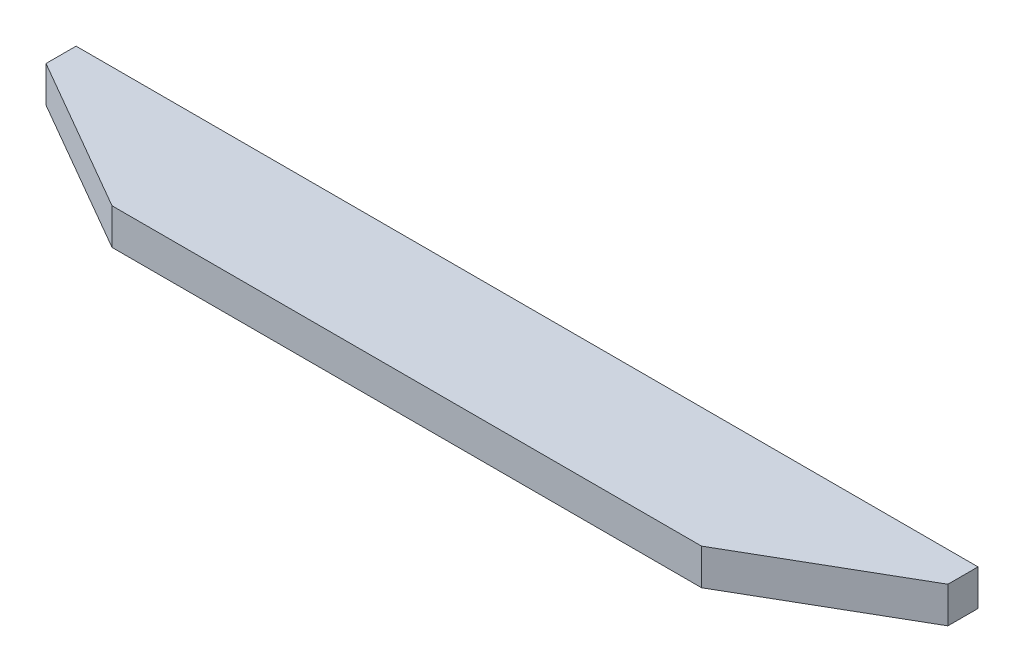
ISO-10303-21;
HEADER;
FILE_DESCRIPTION(('STEP AP214'),'2;1');
FILE_NAME('part.step','',(''),(''),'','','');
FILE_SCHEMA(('AUTOMOTIVE_DESIGN { 1 0 10303 214 1 1 1 1 }'));
ENDSEC;
DATA;
#1=APPLICATION_CONTEXT('core data for automotive mechanical design processes');
#2=APPLICATION_PROTOCOL_DEFINITION('international standard','automotive_design',2000,#1);
#3=PRODUCT_CONTEXT('',#1,'mechanical');
#4=PRODUCT('Part','Part','',(#3));
#5=PRODUCT_RELATED_PRODUCT_CATEGORY('part','',(#4));
#6=PRODUCT_DEFINITION_FORMATION('','',#4);
#7=PRODUCT_DEFINITION_CONTEXT('part definition',#1,'design');
#8=PRODUCT_DEFINITION('design','',#6,#7);
#9=PRODUCT_DEFINITION_SHAPE('','',#8);
#10=(LENGTH_UNIT() NAMED_UNIT(*) SI_UNIT(.MILLI.,.METRE.));
#11=(NAMED_UNIT(*) PLANE_ANGLE_UNIT() SI_UNIT($,.RADIAN.));
#12=(NAMED_UNIT(*) SI_UNIT($,.STERADIAN.) SOLID_ANGLE_UNIT());
#13=UNCERTAINTY_MEASURE_WITH_UNIT(LENGTH_MEASURE(1.E-05),#10,'distance_accuracy_value','');
#14=(GEOMETRIC_REPRESENTATION_CONTEXT(3) GLOBAL_UNCERTAINTY_ASSIGNED_CONTEXT((#13)) GLOBAL_UNIT_ASSIGNED_CONTEXT((#10,
#11,#12)) REPRESENTATION_CONTEXT('',''));
#15=CARTESIAN_POINT('',(0.,0.,0.));
#16=DIRECTION('',(0.,0.,1.));
#17=DIRECTION('',(1.,0.,0.));
#18=AXIS2_PLACEMENT_3D('',#15,#16,#17);
#19=CARTESIAN_POINT('',(-75.,6.,20.));
#20=DIRECTION('',(1.,0.,0.));
#21=DIRECTION('',(0.,0.,-1.));
#22=AXIS2_PLACEMENT_3D('',#19,#20,#21);
#23=PLANE('',#22);
#24=DIRECTION('',(0.,0.,-1.));
#25=VECTOR('',#24,1.);
#26=CARTESIAN_POINT('',(-75.,0.,20.));
#27=LINE('',#26,#25);
#28=CARTESIAN_POINT('',(-75.,0.,4.99999999999998));
#29=VERTEX_POINT('',#28);
#30=CARTESIAN_POINT('',(-75.,0.,0.));
#31=VERTEX_POINT('',#30);
#32=EDGE_CURVE('E100',#29,#31,#27,.T.);
#33=ORIENTED_EDGE('',*,*,#32,.F.);
#34=DIRECTION('',(0.,1.,0.));
#35=VECTOR('',#34,1.);
#36=CARTESIAN_POINT('',(-75.,6.,4.99999999999998));
#37=LINE('',#36,#35);
#38=CARTESIAN_POINT('',(-75.,6.,4.99999999999998));
#39=VERTEX_POINT('',#38);
#40=EDGE_CURVE('E11',#29,#39,#37,.T.);
#41=ORIENTED_EDGE('',*,*,#40,.T.);
#42=DIRECTION('',(0.,0.,-1.));
#43=VECTOR('',#42,1.);
#44=CARTESIAN_POINT('',(-75.,6.,20.));
#45=LINE('',#44,#43);
#46=CARTESIAN_POINT('',(-75.,6.,0.));
#47=VERTEX_POINT('',#46);
#48=EDGE_CURVE('E122',#39,#47,#45,.T.);
#49=ORIENTED_EDGE('',*,*,#48,.T.);
#50=DIRECTION('',(0.,-1.,0.));
#51=VECTOR('',#50,1.);
#52=CARTESIAN_POINT('',(-75.,6.,0.));
#53=LINE('',#52,#51);
#54=EDGE_CURVE('E116',#47,#31,#53,.T.);
#55=ORIENTED_EDGE('',*,*,#54,.T.);
#56=EDGE_LOOP('',(#33,#41,#49,#55));
#57=FACE_BOUND('',#56,.T.);
#58=ADVANCED_FACE('F47',(#57),#23,.F.);
#59=CARTESIAN_POINT('',(-75.,0.,20.));
#60=DIRECTION('',(0.,1.,0.));
#61=DIRECTION('',(0.,0.,1.));
#62=AXIS2_PLACEMENT_3D('',#59,#60,#61);
#63=PLANE('',#62);
#64=DIRECTION('',(0.,0.,-1.));
#65=VECTOR('',#64,1.);
#66=CARTESIAN_POINT('',(75.,0.,20.));
#67=LINE('',#66,#65);
#68=CARTESIAN_POINT('',(75.,0.,4.99999999999998));
#69=VERTEX_POINT('',#68);
#70=CARTESIAN_POINT('',(75.,0.,0.));
#71=VERTEX_POINT('',#70);
#72=EDGE_CURVE('E110',#69,#71,#67,.T.);
#73=ORIENTED_EDGE('',*,*,#72,.F.);
#74=DIRECTION('',(-0.866025403784438,0.,0.500000000000001));
#75=VECTOR('',#74,1.);
#76=CARTESIAN_POINT('',(49.0192378864669,0.,20.));
#77=LINE('',#76,#75);
#78=CARTESIAN_POINT('',(49.0192378864669,0.,20.));
#79=VERTEX_POINT('',#78);
#80=EDGE_CURVE('E57',#69,#79,#77,.T.);
#81=ORIENTED_EDGE('',*,*,#80,.T.);
#82=DIRECTION('',(1.,0.,0.));
#83=VECTOR('',#82,1.);
#84=CARTESIAN_POINT('',(-75.,0.,20.));
#85=LINE('',#84,#83);
#86=CARTESIAN_POINT('',(-49.0192378864669,0.,20.));
#87=VERTEX_POINT('',#86);
#88=EDGE_CURVE('E136',#87,#79,#85,.T.);
#89=ORIENTED_EDGE('',*,*,#88,.F.);
#90=DIRECTION('',(-0.866025403784438,0.,-0.500000000000001));
#91=VECTOR('',#90,1.);
#92=CARTESIAN_POINT('',(-49.0192378864669,0.,20.));
#93=LINE('',#92,#91);
#94=EDGE_CURVE('E64',#87,#29,#93,.T.);
#95=ORIENTED_EDGE('',*,*,#94,.T.);
#96=ORIENTED_EDGE('',*,*,#32,.T.);
#97=DIRECTION('',(1.,0.,0.));
#98=VECTOR('',#97,1.);
#99=CARTESIAN_POINT('',(-75.,0.,0.));
#100=LINE('',#99,#98);
#101=EDGE_CURVE('E103',#31,#71,#100,.T.);
#102=ORIENTED_EDGE('',*,*,#101,.T.);
#103=EDGE_LOOP('',(#73,#81,#89,#95,#96,#102));
#104=FACE_BOUND('',#103,.T.);
#105=ADVANCED_FACE('F102',(#104),#63,.F.);
#106=CARTESIAN_POINT('',(75.,6.,20.));
#107=DIRECTION('',(-1.,0.,0.));
#108=DIRECTION('',(0.,0.,1.));
#109=AXIS2_PLACEMENT_3D('',#106,#107,#108);
#110=PLANE('',#109);
#111=DIRECTION('',(0.,0.,-1.));
#112=VECTOR('',#111,1.);
#113=CARTESIAN_POINT('',(75.,6.,20.));
#114=LINE('',#113,#112);
#115=CARTESIAN_POINT('',(75.,6.,4.99999999999998));
#116=VERTEX_POINT('',#115);
#117=CARTESIAN_POINT('',(75.,6.,0.));
#118=VERTEX_POINT('',#117);
#119=EDGE_CURVE('E139',#116,#118,#114,.T.);
#120=ORIENTED_EDGE('',*,*,#119,.F.);
#121=DIRECTION('',(0.,-1.,0.));
#122=VECTOR('',#121,1.);
#123=CARTESIAN_POINT('',(75.,0.,4.99999999999998));
#124=LINE('',#123,#122);
#125=EDGE_CURVE('E72',#116,#69,#124,.T.);
#126=ORIENTED_EDGE('',*,*,#125,.T.);
#127=ORIENTED_EDGE('',*,*,#72,.T.);
#128=DIRECTION('',(0.,1.,0.));
#129=VECTOR('',#128,1.);
#130=CARTESIAN_POINT('',(75.,6.,0.));
#131=LINE('',#130,#129);
#132=EDGE_CURVE('E118',#71,#118,#131,.T.);
#133=ORIENTED_EDGE('',*,*,#132,.T.);
#134=EDGE_LOOP('',(#120,#126,#127,#133));
#135=FACE_BOUND('',#134,.T.);
#136=ADVANCED_FACE('F175',(#135),#110,.F.);
#137=CARTESIAN_POINT('',(-75.,6.,20.));
#138=DIRECTION('',(0.,-1.,0.));
#139=DIRECTION('',(1.,0.,0.));
#140=AXIS2_PLACEMENT_3D('',#137,#138,#139);
#141=PLANE('',#140);
#142=DIRECTION('',(-1.,0.,0.));
#143=VECTOR('',#142,1.);
#144=CARTESIAN_POINT('',(-75.,6.,20.));
#145=LINE('',#144,#143);
#146=CARTESIAN_POINT('',(49.0192378864669,6.,20.));
#147=VERTEX_POINT('',#146);
#148=CARTESIAN_POINT('',(-49.0192378864669,6.,20.));
#149=VERTEX_POINT('',#148);
#150=EDGE_CURVE('E128',#147,#149,#145,.T.);
#151=ORIENTED_EDGE('',*,*,#150,.F.);
#152=DIRECTION('',(0.866025403784438,0.,-0.500000000000001));
#153=VECTOR('',#152,1.);
#154=CARTESIAN_POINT('',(49.0192378864669,6.,20.));
#155=LINE('',#154,#153);
#156=EDGE_CURVE('E154',#147,#116,#155,.T.);
#157=ORIENTED_EDGE('',*,*,#156,.T.);
#158=ORIENTED_EDGE('',*,*,#119,.T.);
#159=DIRECTION('',(-1.,0.,0.));
#160=VECTOR('',#159,1.);
#161=CARTESIAN_POINT('',(-75.,6.,0.));
#162=LINE('',#161,#160);
#163=EDGE_CURVE('E133',#118,#47,#162,.T.);
#164=ORIENTED_EDGE('',*,*,#163,.T.);
#165=ORIENTED_EDGE('',*,*,#48,.F.);
#166=DIRECTION('',(0.866025403784438,0.,0.500000000000001));
#167=VECTOR('',#166,1.);
#168=CARTESIAN_POINT('',(-49.0192378864669,6.,20.));
#169=LINE('',#168,#167);
#170=EDGE_CURVE('E151',#39,#149,#169,.T.);
#171=ORIENTED_EDGE('',*,*,#170,.T.);
#172=EDGE_LOOP('',(#151,#157,#158,#164,#165,#171));
#173=FACE_BOUND('',#172,.T.);
#174=ADVANCED_FACE('F174',(#173),#141,.F.);
#175=CARTESIAN_POINT('',(0.,0.,20.));
#176=DIRECTION('',(0.,0.,1.));
#177=DIRECTION('',(1.,0.,0.));
#178=AXIS2_PLACEMENT_3D('',#175,#176,#177);
#179=PLANE('',#178);
#180=ORIENTED_EDGE('',*,*,#88,.T.);
#181=DIRECTION('',(0.,1.,0.));
#182=VECTOR('',#181,1.);
#183=CARTESIAN_POINT('',(49.0192378864669,6.,20.));
#184=LINE('',#183,#182);
#185=EDGE_CURVE('E147',#79,#147,#184,.T.);
#186=ORIENTED_EDGE('',*,*,#185,.T.);
#187=ORIENTED_EDGE('',*,*,#150,.T.);
#188=DIRECTION('',(0.,-1.,0.));
#189=VECTOR('',#188,1.);
#190=CARTESIAN_POINT('',(-49.0192378864669,0.,20.));
#191=LINE('',#190,#189);
#192=EDGE_CURVE('E109',#149,#87,#191,.T.);
#193=ORIENTED_EDGE('',*,*,#192,.T.);
#194=EDGE_LOOP('',(#180,#186,#187,#193));
#195=FACE_BOUND('',#194,.T.);
#196=ADVANCED_FACE('F167',(#195),#179,.T.);
#197=CARTESIAN_POINT('',(0.,0.,0.));
#198=DIRECTION('',(0.,0.,1.));
#199=DIRECTION('',(1.,0.,0.));
#200=AXIS2_PLACEMENT_3D('',#197,#198,#199);
#201=PLANE('',#200);
#202=ORIENTED_EDGE('',*,*,#54,.F.);
#203=ORIENTED_EDGE('',*,*,#163,.F.);
#204=ORIENTED_EDGE('',*,*,#132,.F.);
#205=ORIENTED_EDGE('',*,*,#101,.F.);
#206=EDGE_LOOP('',(#202,#203,#204,#205));
#207=FACE_BOUND('',#206,.T.);
#208=ADVANCED_FACE('F114',(#207),#201,.F.);
#209=CARTESIAN_POINT('',(49.0192378864669,0.,20.));
#210=DIRECTION('',(0.500000000000001,0.,0.866025403784438));
#211=DIRECTION('',(0.,-1.,0.));
#212=AXIS2_PLACEMENT_3D('',#209,#210,#211);
#213=PLANE('',#212);
#214=ORIENTED_EDGE('',*,*,#80,.F.);
#215=ORIENTED_EDGE('',*,*,#125,.F.);
#216=ORIENTED_EDGE('',*,*,#156,.F.);
#217=ORIENTED_EDGE('',*,*,#185,.F.);
#218=EDGE_LOOP('',(#214,#215,#216,#217));
#219=FACE_BOUND('',#218,.T.);
#220=ADVANCED_FACE('F172',(#219),#213,.T.);
#221=CARTESIAN_POINT('',(-49.0192378864669,0.,20.));
#222=DIRECTION('',(-0.500000000000001,0.,0.866025403784438));
#223=DIRECTION('',(0.,1.,0.));
#224=AXIS2_PLACEMENT_3D('',#221,#222,#223);
#225=PLANE('',#224);
#226=ORIENTED_EDGE('',*,*,#170,.F.);
#227=ORIENTED_EDGE('',*,*,#40,.F.);
#228=ORIENTED_EDGE('',*,*,#94,.F.);
#229=ORIENTED_EDGE('',*,*,#192,.F.);
#230=EDGE_LOOP('',(#226,#227,#228,#229));
#231=FACE_BOUND('',#230,.T.);
#232=ADVANCED_FACE('F50',(#231),#225,.T.);
#233=CLOSED_SHELL('',(#58,#105,#136,#174,#196,#208,#220,#232));
#234=MANIFOLD_SOLID_BREP('B2',#233);
#235=ADVANCED_BREP_SHAPE_REPRESENTATION('',(#18,#234),#14);
#236=SHAPE_DEFINITION_REPRESENTATION(#9,#235);
ENDSEC;
END-ISO-10303-21;
